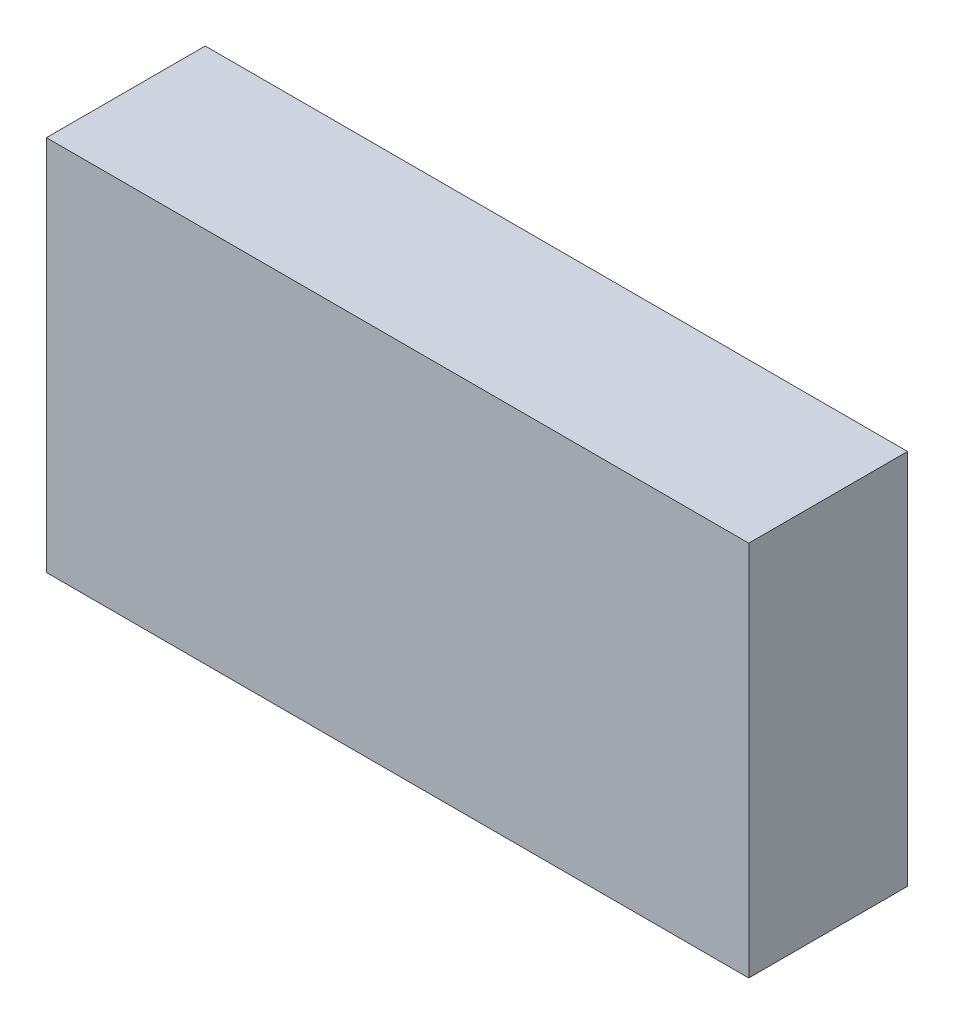
ISO-10303-21;
HEADER;
FILE_DESCRIPTION(('STEP AP214'),'2;1');
FILE_NAME('part.step','',(''),(''),'','','');
FILE_SCHEMA(('AUTOMOTIVE_DESIGN { 1 0 10303 214 1 1 1 1 }'));
ENDSEC;
DATA;
#1=APPLICATION_CONTEXT('core data for automotive mechanical design processes');
#2=APPLICATION_PROTOCOL_DEFINITION('international standard','automotive_design',2000,#1);
#3=PRODUCT_CONTEXT('',#1,'mechanical');
#4=PRODUCT('Part','Part','',(#3));
#5=PRODUCT_RELATED_PRODUCT_CATEGORY('part','',(#4));
#6=PRODUCT_DEFINITION_FORMATION('','',#4);
#7=PRODUCT_DEFINITION_CONTEXT('part definition',#1,'design');
#8=PRODUCT_DEFINITION('design','',#6,#7);
#9=PRODUCT_DEFINITION_SHAPE('','',#8);
#10=(LENGTH_UNIT() NAMED_UNIT(*) SI_UNIT(.MILLI.,.METRE.));
#11=(NAMED_UNIT(*) PLANE_ANGLE_UNIT() SI_UNIT($,.RADIAN.));
#12=(NAMED_UNIT(*) SI_UNIT($,.STERADIAN.) SOLID_ANGLE_UNIT());
#13=UNCERTAINTY_MEASURE_WITH_UNIT(LENGTH_MEASURE(1.E-05),#10,'distance_accuracy_value','');
#14=(GEOMETRIC_REPRESENTATION_CONTEXT(3) GLOBAL_UNCERTAINTY_ASSIGNED_CONTEXT((#13)) GLOBAL_UNIT_ASSIGNED_CONTEXT((#10,
#11,#12)) REPRESENTATION_CONTEXT('',''));
#15=CARTESIAN_POINT('',(0.,0.,0.));
#16=DIRECTION('',(0.,0.,1.));
#17=DIRECTION('',(1.,0.,0.));
#18=AXIS2_PLACEMENT_3D('',#15,#16,#17);
#19=CARTESIAN_POINT('',(3.45000072,1.85000138,1.55999942));
#20=DIRECTION('',(0.,0.,-1.));
#21=DIRECTION('',(-1.,0.,0.));
#22=AXIS2_PLACEMENT_3D('',#19,#20,#21);
#23=PLANE('',#22);
#24=DIRECTION('',(0.,1.,0.));
#25=VECTOR('',#24,1.);
#26=CARTESIAN_POINT('',(-3.45000072,1.85000138,1.55999942));
#27=LINE('',#26,#25);
#28=CARTESIAN_POINT('',(-3.45000072,1.85000138,1.55999942));
#29=VERTEX_POINT('',#28);
#30=CARTESIAN_POINT('',(-3.45000072,-1.84999884,1.55999942));
#31=VERTEX_POINT('',#30);
#32=EDGE_CURVE('E55',#29,#31,#27,.F.);
#33=ORIENTED_EDGE('',*,*,#32,.T.);
#34=DIRECTION('',(1.,0.,0.));
#35=VECTOR('',#34,1.);
#36=CARTESIAN_POINT('',(-3.45000072,-1.84999884,1.55999942));
#37=LINE('',#36,#35);
#38=CARTESIAN_POINT('',(3.45000072,-1.84999884,1.55999942));
#39=VERTEX_POINT('',#38);
#40=EDGE_CURVE('E57',#31,#39,#37,.T.);
#41=ORIENTED_EDGE('',*,*,#40,.T.);
#42=DIRECTION('',(0.,1.,0.));
#43=VECTOR('',#42,1.);
#44=CARTESIAN_POINT('',(3.45000072,-1.84999884,1.55999942));
#45=LINE('',#44,#43);
#46=CARTESIAN_POINT('',(3.45000072,1.85000138,1.55999942));
#47=VERTEX_POINT('',#46);
#48=EDGE_CURVE('E20',#39,#47,#45,.T.);
#49=ORIENTED_EDGE('',*,*,#48,.T.);
#50=DIRECTION('',(1.,0.,0.));
#51=VECTOR('',#50,1.);
#52=CARTESIAN_POINT('',(3.45000072,1.85000138,1.55999942));
#53=LINE('',#52,#51);
#54=EDGE_CURVE('E80',#47,#29,#53,.F.);
#55=ORIENTED_EDGE('',*,*,#54,.T.);
#56=EDGE_LOOP('',(#33,#41,#49,#55));
#57=FACE_BOUND('',#56,.T.);
#58=ADVANCED_FACE('F17',(#57),#23,.F.);
#59=CARTESIAN_POINT('',(3.45000072,-1.84999884,0.));
#60=DIRECTION('',(-1.,0.,0.));
#61=DIRECTION('',(0.,0.,1.));
#62=AXIS2_PLACEMENT_3D('',#59,#60,#61);
#63=PLANE('',#62);
#64=DIRECTION('',(0.,0.,-1.));
#65=VECTOR('',#64,1.);
#66=CARTESIAN_POINT('',(3.45000072,1.85000138,0.));
#67=LINE('',#66,#65);
#68=CARTESIAN_POINT('',(3.45000072,1.85000138,0.));
#69=VERTEX_POINT('',#68);
#70=EDGE_CURVE('E68',#69,#47,#67,.F.);
#71=ORIENTED_EDGE('',*,*,#70,.T.);
#72=ORIENTED_EDGE('',*,*,#48,.F.);
#73=DIRECTION('',(0.,0.,1.));
#74=VECTOR('',#73,1.);
#75=CARTESIAN_POINT('',(3.45000072,-1.84999884,0.));
#76=LINE('',#75,#74);
#77=CARTESIAN_POINT('',(3.45000072,-1.84999884,0.));
#78=VERTEX_POINT('',#77);
#79=EDGE_CURVE('E63',#39,#78,#76,.F.);
#80=ORIENTED_EDGE('',*,*,#79,.T.);
#81=DIRECTION('',(0.,1.,0.));
#82=VECTOR('',#81,1.);
#83=CARTESIAN_POINT('',(3.45000072,1.85000138,0.));
#84=LINE('',#83,#82);
#85=EDGE_CURVE('E83',#69,#78,#84,.F.);
#86=ORIENTED_EDGE('',*,*,#85,.F.);
#87=EDGE_LOOP('',(#71,#72,#80,#86));
#88=FACE_BOUND('',#87,.T.);
#89=ADVANCED_FACE('F65',(#88),#63,.F.);
#90=CARTESIAN_POINT('',(-3.45000072,-1.84999884,0.));
#91=DIRECTION('',(0.,1.,0.));
#92=DIRECTION('',(0.,0.,1.));
#93=AXIS2_PLACEMENT_3D('',#90,#91,#92);
#94=PLANE('',#93);
#95=ORIENTED_EDGE('',*,*,#79,.F.);
#96=ORIENTED_EDGE('',*,*,#40,.F.);
#97=DIRECTION('',(0.,0.,-1.));
#98=VECTOR('',#97,1.);
#99=CARTESIAN_POINT('',(-3.45000072,-1.84999884,0.));
#100=LINE('',#99,#98);
#101=CARTESIAN_POINT('',(-3.45000072,-1.84999884,0.));
#102=VERTEX_POINT('',#101);
#103=EDGE_CURVE('E75',#31,#102,#100,.T.);
#104=ORIENTED_EDGE('',*,*,#103,.T.);
#105=DIRECTION('',(-1.,0.,0.));
#106=VECTOR('',#105,1.);
#107=CARTESIAN_POINT('',(3.45000072,-1.84999884,0.));
#108=LINE('',#107,#106);
#109=EDGE_CURVE('E72',#78,#102,#108,.T.);
#110=ORIENTED_EDGE('',*,*,#109,.F.);
#111=EDGE_LOOP('',(#95,#96,#104,#110));
#112=FACE_BOUND('',#111,.T.);
#113=ADVANCED_FACE('F70',(#112),#94,.F.);
#114=CARTESIAN_POINT('',(-3.45000072,1.85000138,0.));
#115=DIRECTION('',(1.,0.,0.));
#116=DIRECTION('',(0.,0.,-1.));
#117=AXIS2_PLACEMENT_3D('',#114,#115,#116);
#118=PLANE('',#117);
#119=ORIENTED_EDGE('',*,*,#103,.F.);
#120=ORIENTED_EDGE('',*,*,#32,.F.);
#121=DIRECTION('',(0.,0.,-1.));
#122=VECTOR('',#121,1.);
#123=CARTESIAN_POINT('',(-3.45000072,1.85000138,0.));
#124=LINE('',#123,#122);
#125=CARTESIAN_POINT('',(-3.45000072,1.85000138,0.));
#126=VERTEX_POINT('',#125);
#127=EDGE_CURVE('E35',#29,#126,#124,.T.);
#128=ORIENTED_EDGE('',*,*,#127,.T.);
#129=DIRECTION('',(0.,1.,0.));
#130=VECTOR('',#129,1.);
#131=CARTESIAN_POINT('',(-3.45000072,1.85000138,0.));
#132=LINE('',#131,#130);
#133=EDGE_CURVE('E26',#102,#126,#132,.T.);
#134=ORIENTED_EDGE('',*,*,#133,.F.);
#135=EDGE_LOOP('',(#119,#120,#128,#134));
#136=FACE_BOUND('',#135,.T.);
#137=ADVANCED_FACE('F89',(#136),#118,.F.);
#138=CARTESIAN_POINT('',(3.45000072,1.85000138,0.));
#139=DIRECTION('',(0.,-1.,0.));
#140=DIRECTION('',(0.,0.,-1.));
#141=AXIS2_PLACEMENT_3D('',#138,#139,#140);
#142=PLANE('',#141);
#143=ORIENTED_EDGE('',*,*,#127,.F.);
#144=ORIENTED_EDGE('',*,*,#54,.F.);
#145=ORIENTED_EDGE('',*,*,#70,.F.);
#146=DIRECTION('',(-1.,0.,0.));
#147=VECTOR('',#146,1.);
#148=CARTESIAN_POINT('',(3.45000072,1.85000138,0.));
#149=LINE('',#148,#147);
#150=EDGE_CURVE('E11',#126,#69,#149,.F.);
#151=ORIENTED_EDGE('',*,*,#150,.F.);
#152=EDGE_LOOP('',(#143,#144,#145,#151));
#153=FACE_BOUND('',#152,.T.);
#154=ADVANCED_FACE('F91',(#153),#142,.F.);
#155=CARTESIAN_POINT('',(3.45000072,1.85000138,0.));
#156=DIRECTION('',(0.,0.,-1.));
#157=DIRECTION('',(-1.,0.,0.));
#158=AXIS2_PLACEMENT_3D('',#155,#156,#157);
#159=PLANE('',#158);
#160=ORIENTED_EDGE('',*,*,#133,.T.);
#161=ORIENTED_EDGE('',*,*,#150,.T.);
#162=ORIENTED_EDGE('',*,*,#85,.T.);
#163=ORIENTED_EDGE('',*,*,#109,.T.);
#164=EDGE_LOOP('',(#160,#161,#162,#163));
#165=FACE_BOUND('',#164,.T.);
#166=ADVANCED_FACE('F88',(#165),#159,.T.);
#167=CLOSED_SHELL('',(#58,#89,#113,#137,#154,#166));
#168=MANIFOLD_SOLID_BREP('B1',#167);
#169=ADVANCED_BREP_SHAPE_REPRESENTATION('',(#18,#168),#14);
#170=SHAPE_DEFINITION_REPRESENTATION(#9,#169);
ENDSEC;
END-ISO-10303-21;
